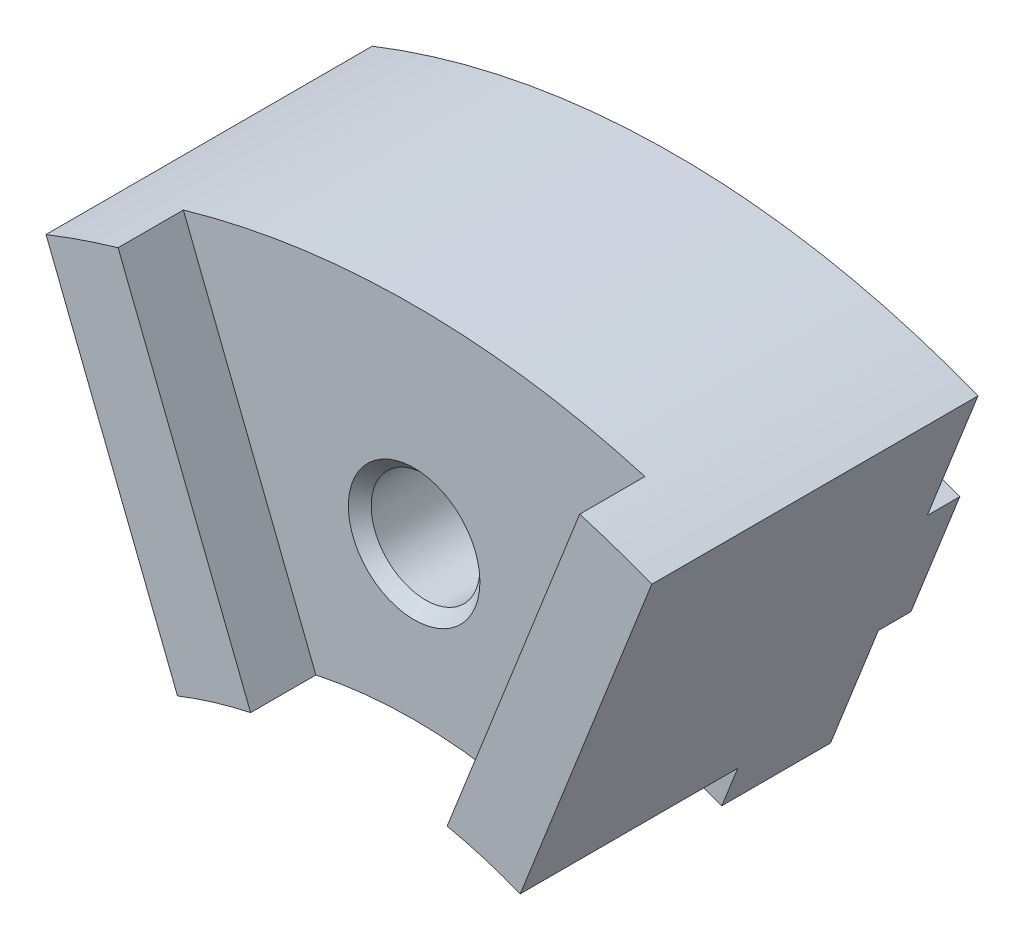
ISO-10303-21;
HEADER;
FILE_DESCRIPTION(('STEP AP214'),'2;1');
FILE_NAME('part.step','',(''),(''),'','','');
FILE_SCHEMA(('AUTOMOTIVE_DESIGN { 1 0 10303 214 1 1 1 1 }'));
ENDSEC;
DATA;
#1=APPLICATION_CONTEXT('core data for automotive mechanical design processes');
#2=APPLICATION_PROTOCOL_DEFINITION('international standard','automotive_design',2000,#1);
#3=PRODUCT_CONTEXT('',#1,'mechanical');
#4=PRODUCT('Part','Part','',(#3));
#5=PRODUCT_RELATED_PRODUCT_CATEGORY('part','',(#4));
#6=PRODUCT_DEFINITION_FORMATION('','',#4);
#7=PRODUCT_DEFINITION_CONTEXT('part definition',#1,'design');
#8=PRODUCT_DEFINITION('design','',#6,#7);
#9=PRODUCT_DEFINITION_SHAPE('','',#8);
#10=(LENGTH_UNIT() NAMED_UNIT(*) SI_UNIT(.MILLI.,.METRE.));
#11=(NAMED_UNIT(*) PLANE_ANGLE_UNIT() SI_UNIT($,.RADIAN.));
#12=(NAMED_UNIT(*) SI_UNIT($,.STERADIAN.) SOLID_ANGLE_UNIT());
#13=UNCERTAINTY_MEASURE_WITH_UNIT(LENGTH_MEASURE(1.E-05),#10,'distance_accuracy_value','');
#14=(GEOMETRIC_REPRESENTATION_CONTEXT(3) GLOBAL_UNCERTAINTY_ASSIGNED_CONTEXT((#13)) GLOBAL_UNIT_ASSIGNED_CONTEXT((#10,
#11,#12)) REPRESENTATION_CONTEXT('',''));
#15=CARTESIAN_POINT('',(0.,0.,0.));
#16=DIRECTION('',(0.,0.,1.));
#17=DIRECTION('',(1.,0.,0.));
#18=AXIS2_PLACEMENT_3D('',#15,#16,#17);
#19=CARTESIAN_POINT('',(0.,0.,0.));
#20=DIRECTION('',(0.,0.,-1.));
#21=DIRECTION('',(-1.,0.,0.));
#22=AXIS2_PLACEMENT_3D('',#19,#20,#21);
#23=PLANE('',#22);
#24=CARTESIAN_POINT('',(0.,28.5,0.));
#25=DIRECTION('',(0.,0.,-1.));
#26=DIRECTION('',(-1.,0.,0.));
#27=AXIS2_PLACEMENT_3D('',#24,#25,#26);
#28=CIRCLE('',#27,2.5);
#29=CARTESIAN_POINT('',(-2.5,28.5,0.));
#30=VERTEX_POINT('',#29);
#31=EDGE_CURVE('E44',#30,#30,#28,.T.);
#32=ORIENTED_EDGE('',*,*,#31,.F.);
#33=EDGE_LOOP('',(#32));
#34=FACE_BOUND('',#33,.T.);
#35=DIRECTION('',(0.366501226724298,-0.930417567982024,0.));
#36=VECTOR('',#35,1.);
#37=CARTESIAN_POINT('',(-7.14677392112381,18.1431425756495,0.));
#38=LINE('',#37,#36);
#39=CARTESIAN_POINT('',(-9.3457812814696,23.7256479835416,0.));
#40=VERTEX_POINT('',#39);
#41=CARTESIAN_POINT('',(-7.14677392112381,18.1431425756495,0.));
#42=VERTEX_POINT('',#41);
#43=EDGE_CURVE('E185',#40,#42,#38,.T.);
#44=ORIENTED_EDGE('',*,*,#43,.F.);
#45=CARTESIAN_POINT('',(0.,0.,0.));
#46=DIRECTION('',(0.,0.,1.));
#47=DIRECTION('',(1.,0.,0.));
#48=AXIS2_PLACEMENT_3D('',#45,#46,#47);
#49=CIRCLE('',#48,25.5);
#50=CARTESIAN_POINT('',(-4.0085103266133,25.1829673581457,0.));
#51=VERTEX_POINT('',#50);
#52=EDGE_CURVE('E179',#51,#40,#49,.T.);
#53=ORIENTED_EDGE('',*,*,#52,.F.);
#54=DIRECTION('',(0.366501226724298,-0.930417567982024,0.));
#55=VECTOR('',#54,1.);
#56=CARTESIAN_POINT('',(-6.29739883182884,30.9936493453214,0.));
#57=LINE('',#56,#55);
#58=CARTESIAN_POINT('',(-6.29739883182884,30.9936493453214,0.));
#59=VERTEX_POINT('',#58);
#60=EDGE_CURVE('E165',#59,#51,#57,.T.);
#61=ORIENTED_EDGE('',*,*,#60,.F.);
#62=CARTESIAN_POINT('',(0.,0.,0.));
#63=DIRECTION('',(0.,0.,-1.));
#64=DIRECTION('',(1.,0.,0.));
#65=AXIS2_PLACEMENT_3D('',#62,#63,#64);
#66=CIRCLE('',#65,31.6269431306261);
#67=CARTESIAN_POINT('',(-11.5913134549141,29.426263510303,0.));
#68=VERTEX_POINT('',#67);
#69=EDGE_CURVE('E172',#68,#59,#66,.T.);
#70=ORIENTED_EDGE('',*,*,#69,.F.);
#71=CARTESIAN_POINT('',(-13.9270466155233,35.3558675833169,0.));
#72=VERTEX_POINT('',#71);
#73=EDGE_CURVE('E278',#72,#68,#38,.T.);
#74=ORIENTED_EDGE('',*,*,#73,.F.);
#75=CARTESIAN_POINT('',(0.,0.,0.));
#76=DIRECTION('',(0.,0.,1.));
#77=DIRECTION('',(-1.,0.,0.));
#78=AXIS2_PLACEMENT_3D('',#75,#76,#77);
#79=CIRCLE('',#78,38.);
#80=CARTESIAN_POINT('',(13.9270466155233,35.3558675833169,0.));
#81=VERTEX_POINT('',#80);
#82=EDGE_CURVE('E285',#81,#72,#79,.T.);
#83=ORIENTED_EDGE('',*,*,#82,.F.);
#84=DIRECTION('',(0.366501226724298,0.930417567982024,0.));
#85=VECTOR('',#84,1.);
#86=CARTESIAN_POINT('',(7.14677392112381,18.1431425756495,0.));
#87=LINE('',#86,#85);
#88=CARTESIAN_POINT('',(11.5913134549141,29.426263510303,0.));
#89=VERTEX_POINT('',#88);
#90=EDGE_CURVE('E281',#89,#81,#87,.T.);
#91=ORIENTED_EDGE('',*,*,#90,.F.);
#92=CARTESIAN_POINT('',(0.,0.,0.));
#93=DIRECTION('',(0.,0.,-1.));
#94=DIRECTION('',(1.,0.,0.));
#95=AXIS2_PLACEMENT_3D('',#92,#93,#94);
#96=CIRCLE('',#95,31.6269431306262);
#97=CARTESIAN_POINT('',(6.29739883182885,30.9936493453214,0.));
#98=VERTEX_POINT('',#97);
#99=EDGE_CURVE('E202',#98,#89,#96,.T.);
#100=ORIENTED_EDGE('',*,*,#99,.F.);
#101=DIRECTION('',(0.366501226724298,0.930417567982024,0.));
#102=VECTOR('',#101,1.);
#103=CARTESIAN_POINT('',(4.0085103266133,25.1829673581457,0.));
#104=LINE('',#103,#102);
#105=CARTESIAN_POINT('',(4.0085103266133,25.1829673581457,0.));
#106=VERTEX_POINT('',#105);
#107=EDGE_CURVE('E64',#106,#98,#104,.T.);
#108=ORIENTED_EDGE('',*,*,#107,.F.);
#109=CARTESIAN_POINT('',(0.,0.,0.));
#110=DIRECTION('',(0.,0.,1.));
#111=DIRECTION('',(1.,0.,0.));
#112=AXIS2_PLACEMENT_3D('',#109,#110,#111);
#113=CIRCLE('',#112,25.5);
#114=CARTESIAN_POINT('',(9.3457812814696,23.7256479835416,0.));
#115=VERTEX_POINT('',#114);
#116=EDGE_CURVE('E186',#115,#106,#113,.T.);
#117=ORIENTED_EDGE('',*,*,#116,.F.);
#118=CARTESIAN_POINT('',(7.14677392112381,18.1431425756495,0.));
#119=VERTEX_POINT('',#118);
#120=EDGE_CURVE('E282',#119,#115,#87,.T.);
#121=ORIENTED_EDGE('',*,*,#120,.F.);
#122=CARTESIAN_POINT('',(0.,0.,0.));
#123=DIRECTION('',(0.,0.,-1.));
#124=DIRECTION('',(-1.,0.,0.));
#125=AXIS2_PLACEMENT_3D('',#122,#123,#124);
#126=CIRCLE('',#125,19.5);
#127=EDGE_CURVE('E273',#42,#119,#126,.T.);
#128=ORIENTED_EDGE('',*,*,#127,.F.);
#129=EDGE_LOOP('',(#44,#53,#61,#70,#74,#83,#91,#100,#108,#117,#121,#128));
#130=FACE_BOUND('',#129,.T.);
#131=ADVANCED_FACE('F40',(#34,#130),#23,.T.);
#132=CARTESIAN_POINT('',(0.,0.,12.));
#133=DIRECTION('',(0.,0.,-1.));
#134=DIRECTION('',(-1.,0.,0.));
#135=AXIS2_PLACEMENT_3D('',#132,#133,#134);
#136=PLANE('',#135);
#137=CARTESIAN_POINT('',(0.,28.5,12.));
#138=DIRECTION('',(0.,0.,1.));
#139=DIRECTION('',(1.,0.,0.));
#140=AXIS2_PLACEMENT_3D('',#137,#138,#139);
#141=CIRCLE('',#140,3.025);
#142=CARTESIAN_POINT('',(3.025,28.5,12.));
#143=VERTEX_POINT('',#142);
#144=EDGE_CURVE('E352',#143,#143,#141,.T.);
#145=ORIENTED_EDGE('',*,*,#144,.F.);
#146=EDGE_LOOP('',(#145));
#147=FACE_BOUND('',#146,.T.);
#148=DIRECTION('',(-0.366501226724299,-0.930417567982024,0.));
#149=VECTOR('',#148,1.);
#150=CARTESIAN_POINT('',(4.5182035939611,21.0198914431906,12.));
#151=LINE('',#150,#149);
#152=CARTESIAN_POINT('',(10.6113850951982,36.4883338392068,12.));
#153=VERTEX_POINT('',#152);
#154=CARTESIAN_POINT('',(4.5182035939611,21.0198914431906,12.));
#155=VERTEX_POINT('',#154);
#156=EDGE_CURVE('E227',#153,#155,#151,.T.);
#157=ORIENTED_EDGE('',*,*,#156,.F.);
#158=CARTESIAN_POINT('',(0.,0.,12.));
#159=DIRECTION('',(0.,0.,1.));
#160=DIRECTION('',(-1.,0.,0.));
#161=AXIS2_PLACEMENT_3D('',#158,#159,#160);
#162=CIRCLE('',#161,38.);
#163=CARTESIAN_POINT('',(-10.6113850951982,36.4883338392068,12.));
#164=VERTEX_POINT('',#163);
#165=EDGE_CURVE('E275',#153,#164,#162,.T.);
#166=ORIENTED_EDGE('',*,*,#165,.T.);
#167=DIRECTION('',(-0.366501226724298,0.930417567982024,0.));
#168=VECTOR('',#167,1.);
#169=CARTESIAN_POINT('',(-10.6113850951982,36.4883338392068,12.));
#170=LINE('',#169,#168);
#171=CARTESIAN_POINT('',(-4.5182035939611,21.0198914431906,12.));
#172=VERTEX_POINT('',#171);
#173=EDGE_CURVE('E230',#172,#164,#170,.T.);
#174=ORIENTED_EDGE('',*,*,#173,.F.);
#175=CARTESIAN_POINT('',(0.,0.,12.));
#176=DIRECTION('',(0.,0.,1.));
#177=DIRECTION('',(-1.,0.,0.));
#178=AXIS2_PLACEMENT_3D('',#175,#176,#177);
#179=CIRCLE('',#178,21.5);
#180=EDGE_CURVE('E258',#155,#172,#179,.T.);
#181=ORIENTED_EDGE('',*,*,#180,.F.);
#182=EDGE_LOOP('',(#157,#166,#174,#181));
#183=FACE_BOUND('',#182,.T.);
#184=ADVANCED_FACE('F324',(#147,#183),#136,.F.);
#185=CARTESIAN_POINT('',(0.,0.,12.));
#186=DIRECTION('',(0.,0.,-1.));
#187=DIRECTION('',(-1.,0.,0.));
#188=AXIS2_PLACEMENT_3D('',#185,#186,#187);
#189=CYLINDRICAL_SURFACE('',#188,19.5);
#190=CARTESIAN_POINT('',(0.,0.,5.));
#191=DIRECTION('',(0.,0.,-1.));
#192=DIRECTION('',(1.,0.,0.));
#193=AXIS2_PLACEMENT_3D('',#190,#191,#192);
#194=CIRCLE('',#193,19.5);
#195=CARTESIAN_POINT('',(-7.14677392112381,18.1431425756495,5.));
#196=VERTEX_POINT('',#195);
#197=CARTESIAN_POINT('',(7.14677392112381,18.1431425756495,5.));
#198=VERTEX_POINT('',#197);
#199=EDGE_CURVE('E259',#196,#198,#194,.T.);
#200=ORIENTED_EDGE('',*,*,#199,.F.);
#201=DIRECTION('',(0.,0.,-1.));
#202=VECTOR('',#201,1.);
#203=CARTESIAN_POINT('',(-7.14677392112381,18.1431425756495,12.));
#204=LINE('',#203,#202);
#205=EDGE_CURVE('E277',#196,#42,#204,.T.);
#206=ORIENTED_EDGE('',*,*,#205,.T.);
#207=ORIENTED_EDGE('',*,*,#127,.T.);
#208=DIRECTION('',(0.,0.,-1.));
#209=VECTOR('',#208,1.);
#210=CARTESIAN_POINT('',(7.14677392112381,18.1431425756495,12.));
#211=LINE('',#210,#209);
#212=EDGE_CURVE('E11',#198,#119,#211,.T.);
#213=ORIENTED_EDGE('',*,*,#212,.F.);
#214=EDGE_LOOP('',(#200,#206,#207,#213));
#215=FACE_BOUND('',#214,.T.);
#216=ADVANCED_FACE('F42',(#215),#189,.F.);
#217=CARTESIAN_POINT('',(7.14677392112381,18.1431425756495,12.));
#218=DIRECTION('',(-0.930417567982024,0.366501226724298,0.));
#219=DIRECTION('',(-0.366501226724298,-0.930417567982024,0.));
#220=AXIS2_PLACEMENT_3D('',#217,#218,#219);
#221=PLANE('',#220);
#222=DIRECTION('',(0.,0.,-1.));
#223=VECTOR('',#222,1.);
#224=CARTESIAN_POINT('',(13.9270466155233,35.3558675833169,12.));
#225=LINE('',#224,#223);
#226=CARTESIAN_POINT('',(13.9270466155233,35.3558675833169,15.));
#227=VERTEX_POINT('',#226);
#228=EDGE_CURVE('E49',#227,#81,#225,.T.);
#229=ORIENTED_EDGE('',*,*,#228,.F.);
#230=DIRECTION('',(0.366501226724299,0.930417567982024,0.));
#231=VECTOR('',#230,1.);
#232=CARTESIAN_POINT('',(7.87977637457241,20.0039777116135,15.));
#233=LINE('',#232,#231);
#234=CARTESIAN_POINT('',(7.87977637457241,20.0039777116135,15.));
#235=VERTEX_POINT('',#234);
#236=EDGE_CURVE('E235',#235,#227,#233,.T.);
#237=ORIENTED_EDGE('',*,*,#236,.F.);
#238=DIRECTION('',(0.,0.,1.));
#239=VECTOR('',#238,1.);
#240=CARTESIAN_POINT('',(7.87977637457241,20.0039777116135,5.));
#241=LINE('',#240,#239);
#242=CARTESIAN_POINT('',(7.87977637457241,20.0039777116135,5.));
#243=VERTEX_POINT('',#242);
#244=EDGE_CURVE('E269',#243,#235,#241,.T.);
#245=ORIENTED_EDGE('',*,*,#244,.F.);
#246=DIRECTION('',(0.366501226724298,0.930417567982024,0.));
#247=VECTOR('',#246,1.);
#248=CARTESIAN_POINT('',(7.14677392112381,18.1431425756495,5.));
#249=LINE('',#248,#247);
#250=EDGE_CURVE('E261',#198,#243,#249,.T.);
#251=ORIENTED_EDGE('',*,*,#250,.F.);
#252=ORIENTED_EDGE('',*,*,#212,.T.);
#253=ORIENTED_EDGE('',*,*,#120,.T.);
#254=DIRECTION('',(0.,0.,1.));
#255=VECTOR('',#254,1.);
#256=CARTESIAN_POINT('',(9.3457812814696,23.7256479835416,-1.5));
#257=LINE('',#256,#255);
#258=CARTESIAN_POINT('',(9.3457812814696,23.7256479835416,-1.5));
#259=VERTEX_POINT('',#258);
#260=EDGE_CURVE('E207',#259,#115,#257,.T.);
#261=ORIENTED_EDGE('',*,*,#260,.F.);
#262=DIRECTION('',(-0.366501226724298,-0.930417567982024,0.));
#263=VECTOR('',#262,1.);
#264=CARTESIAN_POINT('',(9.3457812814696,23.7256479835416,-1.5));
#265=LINE('',#264,#263);
#266=CARTESIAN_POINT('',(11.5913134549141,29.426263510303,-1.5));
#267=VERTEX_POINT('',#266);
#268=EDGE_CURVE('E206',#267,#259,#265,.T.);
#269=ORIENTED_EDGE('',*,*,#268,.F.);
#270=DIRECTION('',(0.,0.,1.));
#271=VECTOR('',#270,1.);
#272=CARTESIAN_POINT('',(11.5913134549141,29.426263510303,-1.5));
#273=LINE('',#272,#271);
#274=EDGE_CURVE('E214',#267,#89,#273,.T.);
#275=ORIENTED_EDGE('',*,*,#274,.T.);
#276=ORIENTED_EDGE('',*,*,#90,.T.);
#277=EDGE_LOOP('',(#229,#237,#245,#251,#252,#253,#261,#269,#275,#276));
#278=FACE_BOUND('',#277,.T.);
#279=ADVANCED_FACE('F333',(#278),#221,.F.);
#280=CARTESIAN_POINT('',(0.,0.,12.));
#281=DIRECTION('',(0.,0.,-1.));
#282=DIRECTION('',(-1.,0.,0.));
#283=AXIS2_PLACEMENT_3D('',#280,#281,#282);
#284=CYLINDRICAL_SURFACE('',#283,38.);
#285=ORIENTED_EDGE('',*,*,#82,.T.);
#286=DIRECTION('',(0.,0.,-1.));
#287=VECTOR('',#286,1.);
#288=CARTESIAN_POINT('',(-13.9270466155233,35.3558675833169,12.));
#289=LINE('',#288,#287);
#290=CARTESIAN_POINT('',(-13.9270466155233,35.3558675833169,15.));
#291=VERTEX_POINT('',#290);
#292=EDGE_CURVE('E291',#291,#72,#289,.T.);
#293=ORIENTED_EDGE('',*,*,#292,.F.);
#294=CARTESIAN_POINT('',(0.,0.,15.));
#295=DIRECTION('',(0.,0.,1.));
#296=DIRECTION('',(1.,0.,0.));
#297=AXIS2_PLACEMENT_3D('',#294,#295,#296);
#298=CIRCLE('',#297,38.);
#299=CARTESIAN_POINT('',(-10.6113850951982,36.4883338392068,15.));
#300=VERTEX_POINT('',#299);
#301=EDGE_CURVE('E240',#300,#291,#298,.T.);
#302=ORIENTED_EDGE('',*,*,#301,.F.);
#303=DIRECTION('',(0.,0.,-1.));
#304=VECTOR('',#303,1.);
#305=CARTESIAN_POINT('',(-10.6113850951982,36.4883338392068,15.));
#306=LINE('',#305,#304);
#307=EDGE_CURVE('E250',#300,#164,#306,.T.);
#308=ORIENTED_EDGE('',*,*,#307,.T.);
#309=ORIENTED_EDGE('',*,*,#165,.F.);
#310=DIRECTION('',(0.,0.,-1.));
#311=VECTOR('',#310,1.);
#312=CARTESIAN_POINT('',(10.6113850951982,36.4883338392068,15.));
#313=LINE('',#312,#311);
#314=CARTESIAN_POINT('',(10.6113850951982,36.4883338392068,15.));
#315=VERTEX_POINT('',#314);
#316=EDGE_CURVE('E222',#315,#153,#313,.T.);
#317=ORIENTED_EDGE('',*,*,#316,.F.);
#318=CARTESIAN_POINT('',(0.,0.,15.));
#319=DIRECTION('',(0.,0.,1.));
#320=DIRECTION('',(1.,0.,0.));
#321=AXIS2_PLACEMENT_3D('',#318,#319,#320);
#322=CIRCLE('',#321,38.);
#323=EDGE_CURVE('E233',#227,#315,#322,.T.);
#324=ORIENTED_EDGE('',*,*,#323,.F.);
#325=ORIENTED_EDGE('',*,*,#228,.T.);
#326=EDGE_LOOP('',(#285,#293,#302,#308,#309,#317,#324,#325));
#327=FACE_BOUND('',#326,.T.);
#328=ADVANCED_FACE('F298',(#327),#284,.T.);
#329=CARTESIAN_POINT('',(-7.14677392112381,18.1431425756495,12.));
#330=DIRECTION('',(0.930417567982024,0.366501226724298,0.));
#331=DIRECTION('',(-0.366501226724298,0.930417567982024,0.));
#332=AXIS2_PLACEMENT_3D('',#329,#330,#331);
#333=PLANE('',#332);
#334=DIRECTION('',(0.366501226724298,-0.930417567982024,0.));
#335=VECTOR('',#334,1.);
#336=CARTESIAN_POINT('',(-7.87977637457241,20.0039777116135,5.));
#337=LINE('',#336,#335);
#338=CARTESIAN_POINT('',(-7.87977637457241,20.0039777116135,5.));
#339=VERTEX_POINT('',#338);
#340=EDGE_CURVE('E267',#339,#196,#337,.T.);
#341=ORIENTED_EDGE('',*,*,#340,.F.);
#342=DIRECTION('',(0.,0.,1.));
#343=VECTOR('',#342,1.);
#344=CARTESIAN_POINT('',(-7.87977637457241,20.0039777116135,5.));
#345=LINE('',#344,#343);
#346=CARTESIAN_POINT('',(-7.87977637457241,20.0039777116135,15.));
#347=VERTEX_POINT('',#346);
#348=EDGE_CURVE('E271',#339,#347,#345,.T.);
#349=ORIENTED_EDGE('',*,*,#348,.T.);
#350=DIRECTION('',(0.366501226724298,-0.930417567982024,0.));
#351=VECTOR('',#350,1.);
#352=CARTESIAN_POINT('',(-13.9270466155233,35.3558675833169,15.));
#353=LINE('',#352,#351);
#354=EDGE_CURVE('E243',#291,#347,#353,.T.);
#355=ORIENTED_EDGE('',*,*,#354,.F.);
#356=ORIENTED_EDGE('',*,*,#292,.T.);
#357=ORIENTED_EDGE('',*,*,#73,.T.);
#358=DIRECTION('',(0.,0.,1.));
#359=VECTOR('',#358,1.);
#360=CARTESIAN_POINT('',(-11.5913134549141,29.426263510303,-1.5));
#361=LINE('',#360,#359);
#362=CARTESIAN_POINT('',(-11.5913134549141,29.426263510303,-1.5));
#363=VERTEX_POINT('',#362);
#364=EDGE_CURVE('E307',#363,#68,#361,.T.);
#365=ORIENTED_EDGE('',*,*,#364,.F.);
#366=DIRECTION('',(-0.366501226724298,0.930417567982024,0.));
#367=VECTOR('',#366,1.);
#368=CARTESIAN_POINT('',(-11.5913134549141,29.426263510303,-1.5));
#369=LINE('',#368,#367);
#370=CARTESIAN_POINT('',(-9.3457812814696,23.7256479835416,-1.5));
#371=VERTEX_POINT('',#370);
#372=EDGE_CURVE('E195',#371,#363,#369,.T.);
#373=ORIENTED_EDGE('',*,*,#372,.F.);
#374=DIRECTION('',(0.,0.,1.));
#375=VECTOR('',#374,1.);
#376=CARTESIAN_POINT('',(-9.3457812814696,23.7256479835416,-1.5));
#377=LINE('',#376,#375);
#378=EDGE_CURVE('E343',#371,#40,#377,.T.);
#379=ORIENTED_EDGE('',*,*,#378,.T.);
#380=ORIENTED_EDGE('',*,*,#43,.T.);
#381=ORIENTED_EDGE('',*,*,#205,.F.);
#382=EDGE_LOOP('',(#341,#349,#355,#356,#357,#365,#373,#379,#380,#381));
#383=FACE_BOUND('',#382,.T.);
#384=ADVANCED_FACE('F306',(#383),#333,.F.);
#385=CARTESIAN_POINT('',(0.,0.,5.));
#386=DIRECTION('',(0.,0.,1.));
#387=DIRECTION('',(1.,0.,0.));
#388=AXIS2_PLACEMENT_3D('',#385,#386,#387);
#389=CYLINDRICAL_SURFACE('',#388,21.5);
#390=ORIENTED_EDGE('',*,*,#244,.T.);
#391=CARTESIAN_POINT('',(0.,0.,15.));
#392=DIRECTION('',(0.,0.,-1.));
#393=DIRECTION('',(1.,0.,0.));
#394=AXIS2_PLACEMENT_3D('',#391,#392,#393);
#395=CIRCLE('',#394,21.5);
#396=CARTESIAN_POINT('',(4.5182035939611,21.0198914431906,15.));
#397=VERTEX_POINT('',#396);
#398=EDGE_CURVE('E231',#397,#235,#395,.T.);
#399=ORIENTED_EDGE('',*,*,#398,.F.);
#400=DIRECTION('',(0.,0.,-1.));
#401=VECTOR('',#400,1.);
#402=CARTESIAN_POINT('',(4.5182035939611,21.0198914431906,15.));
#403=LINE('',#402,#401);
#404=EDGE_CURVE('E224',#397,#155,#403,.T.);
#405=ORIENTED_EDGE('',*,*,#404,.T.);
#406=ORIENTED_EDGE('',*,*,#180,.T.);
#407=DIRECTION('',(0.,0.,-1.));
#408=VECTOR('',#407,1.);
#409=CARTESIAN_POINT('',(-4.5182035939611,21.0198914431906,15.));
#410=LINE('',#409,#408);
#411=CARTESIAN_POINT('',(-4.5182035939611,21.0198914431906,15.));
#412=VERTEX_POINT('',#411);
#413=EDGE_CURVE('E255',#412,#172,#410,.T.);
#414=ORIENTED_EDGE('',*,*,#413,.F.);
#415=CARTESIAN_POINT('',(0.,0.,15.));
#416=DIRECTION('',(0.,0.,-1.));
#417=DIRECTION('',(1.,0.,0.));
#418=AXIS2_PLACEMENT_3D('',#415,#416,#417);
#419=CIRCLE('',#418,21.5);
#420=EDGE_CURVE('E246',#347,#412,#419,.T.);
#421=ORIENTED_EDGE('',*,*,#420,.F.);
#422=ORIENTED_EDGE('',*,*,#348,.F.);
#423=CARTESIAN_POINT('',(0.,0.,5.));
#424=DIRECTION('',(0.,0.,1.));
#425=DIRECTION('',(-1.,0.,0.));
#426=AXIS2_PLACEMENT_3D('',#423,#424,#425);
#427=CIRCLE('',#426,21.5);
#428=EDGE_CURVE('E264',#243,#339,#427,.T.);
#429=ORIENTED_EDGE('',*,*,#428,.F.);
#430=EDGE_LOOP('',(#390,#399,#405,#406,#414,#421,#422,#429));
#431=FACE_BOUND('',#430,.T.);
#432=ADVANCED_FACE('F337',(#431),#389,.F.);
#433=CARTESIAN_POINT('',(0.,0.,5.));
#434=DIRECTION('',(0.,0.,1.));
#435=DIRECTION('',(1.,0.,0.));
#436=AXIS2_PLACEMENT_3D('',#433,#434,#435);
#437=PLANE('',#436);
#438=ORIENTED_EDGE('',*,*,#199,.T.);
#439=ORIENTED_EDGE('',*,*,#250,.T.);
#440=ORIENTED_EDGE('',*,*,#428,.T.);
#441=ORIENTED_EDGE('',*,*,#340,.T.);
#442=EDGE_LOOP('',(#438,#439,#440,#441));
#443=FACE_BOUND('',#442,.T.);
#444=ADVANCED_FACE('F339',(#443),#437,.T.);
#445=CARTESIAN_POINT('',(-10.6113850951982,36.4883338392068,15.));
#446=DIRECTION('',(-0.930417567982024,-0.366501226724298,0.));
#447=DIRECTION('',(0.366501226724298,-0.930417567982024,0.));
#448=AXIS2_PLACEMENT_3D('',#445,#446,#447);
#449=PLANE('',#448);
#450=ORIENTED_EDGE('',*,*,#173,.T.);
#451=ORIENTED_EDGE('',*,*,#307,.F.);
#452=DIRECTION('',(-0.366501226724298,0.930417567982024,0.));
#453=VECTOR('',#452,1.);
#454=CARTESIAN_POINT('',(-10.6113850951982,36.4883338392068,15.));
#455=LINE('',#454,#453);
#456=EDGE_CURVE('E248',#412,#300,#455,.T.);
#457=ORIENTED_EDGE('',*,*,#456,.F.);
#458=ORIENTED_EDGE('',*,*,#413,.T.);
#459=EDGE_LOOP('',(#450,#451,#457,#458));
#460=FACE_BOUND('',#459,.T.);
#461=ADVANCED_FACE('F319',(#460),#449,.F.);
#462=CARTESIAN_POINT('',(0.,0.,15.));
#463=DIRECTION('',(0.,0.,1.));
#464=DIRECTION('',(1.,0.,0.));
#465=AXIS2_PLACEMENT_3D('',#462,#463,#464);
#466=PLANE('',#465);
#467=ORIENTED_EDGE('',*,*,#301,.T.);
#468=ORIENTED_EDGE('',*,*,#354,.T.);
#469=ORIENTED_EDGE('',*,*,#420,.T.);
#470=ORIENTED_EDGE('',*,*,#456,.T.);
#471=EDGE_LOOP('',(#467,#468,#469,#470));
#472=FACE_BOUND('',#471,.T.);
#473=ADVANCED_FACE('F314',(#472),#466,.T.);
#474=CARTESIAN_POINT('',(4.5182035939611,21.0198914431906,15.));
#475=DIRECTION('',(0.930417567982024,-0.366501226724299,0.));
#476=DIRECTION('',(0.366501226724299,0.930417567982024,0.));
#477=AXIS2_PLACEMENT_3D('',#474,#475,#476);
#478=PLANE('',#477);
#479=ORIENTED_EDGE('',*,*,#156,.T.);
#480=ORIENTED_EDGE('',*,*,#404,.F.);
#481=DIRECTION('',(-0.366501226724299,-0.930417567982024,0.));
#482=VECTOR('',#481,1.);
#483=CARTESIAN_POINT('',(4.5182035939611,21.0198914431906,15.));
#484=LINE('',#483,#482);
#485=EDGE_CURVE('E226',#315,#397,#484,.T.);
#486=ORIENTED_EDGE('',*,*,#485,.F.);
#487=ORIENTED_EDGE('',*,*,#316,.T.);
#488=EDGE_LOOP('',(#479,#480,#486,#487));
#489=FACE_BOUND('',#488,.T.);
#490=ADVANCED_FACE('F328',(#489),#478,.F.);
#491=CARTESIAN_POINT('',(0.,0.,15.));
#492=DIRECTION('',(0.,0.,1.));
#493=DIRECTION('',(1.,0.,0.));
#494=AXIS2_PLACEMENT_3D('',#491,#492,#493);
#495=PLANE('',#494);
#496=ORIENTED_EDGE('',*,*,#398,.T.);
#497=ORIENTED_EDGE('',*,*,#236,.T.);
#498=ORIENTED_EDGE('',*,*,#323,.T.);
#499=ORIENTED_EDGE('',*,*,#485,.T.);
#500=EDGE_LOOP('',(#496,#497,#498,#499));
#501=FACE_BOUND('',#500,.T.);
#502=ADVANCED_FACE('F331',(#501),#495,.T.);
#503=CARTESIAN_POINT('',(0.,0.,-1.5));
#504=DIRECTION('',(0.,0.,1.));
#505=DIRECTION('',(1.,0.,0.));
#506=AXIS2_PLACEMENT_3D('',#503,#504,#505);
#507=CYLINDRICAL_SURFACE('',#506,25.5);
#508=ORIENTED_EDGE('',*,*,#116,.T.);
#509=DIRECTION('',(0.,0.,1.));
#510=VECTOR('',#509,1.);
#511=CARTESIAN_POINT('',(4.0085103266133,25.1829673581457,-1.5));
#512=LINE('',#511,#510);
#513=CARTESIAN_POINT('',(4.0085103266133,25.1829673581457,-1.5));
#514=VERTEX_POINT('',#513);
#515=EDGE_CURVE('E220',#514,#106,#512,.T.);
#516=ORIENTED_EDGE('',*,*,#515,.F.);
#517=CARTESIAN_POINT('',(0.,0.,-1.5));
#518=DIRECTION('',(0.,0.,1.));
#519=DIRECTION('',(1.,0.,0.));
#520=AXIS2_PLACEMENT_3D('',#517,#518,#519);
#521=CIRCLE('',#520,25.5);
#522=EDGE_CURVE('E198',#259,#514,#521,.T.);
#523=ORIENTED_EDGE('',*,*,#522,.F.);
#524=ORIENTED_EDGE('',*,*,#260,.T.);
#525=EDGE_LOOP('',(#508,#516,#523,#524));
#526=FACE_BOUND('',#525,.T.);
#527=ADVANCED_FACE('F420',(#526),#507,.F.);
#528=CARTESIAN_POINT('',(4.0085103266133,25.1829673581457,-1.5));
#529=DIRECTION('',(0.930417567982024,-0.366501226724298,0.));
#530=DIRECTION('',(0.366501226724298,0.930417567982024,0.));
#531=AXIS2_PLACEMENT_3D('',#528,#529,#530);
#532=PLANE('',#531);
#533=ORIENTED_EDGE('',*,*,#107,.T.);
#534=DIRECTION('',(0.,0.,1.));
#535=VECTOR('',#534,1.);
#536=CARTESIAN_POINT('',(6.29739883182885,30.9936493453214,-1.5));
#537=LINE('',#536,#535);
#538=CARTESIAN_POINT('',(6.29739883182885,30.9936493453214,-1.5));
#539=VERTEX_POINT('',#538);
#540=EDGE_CURVE('E217',#539,#98,#537,.T.);
#541=ORIENTED_EDGE('',*,*,#540,.F.);
#542=DIRECTION('',(0.366501226724298,0.930417567982024,0.));
#543=VECTOR('',#542,1.);
#544=CARTESIAN_POINT('',(4.0085103266133,25.1829673581457,-1.5));
#545=LINE('',#544,#543);
#546=EDGE_CURVE('E201',#514,#539,#545,.T.);
#547=ORIENTED_EDGE('',*,*,#546,.F.);
#548=ORIENTED_EDGE('',*,*,#515,.T.);
#549=EDGE_LOOP('',(#533,#541,#547,#548));
#550=FACE_BOUND('',#549,.T.);
#551=ADVANCED_FACE('F426',(#550),#532,.F.);
#552=CARTESIAN_POINT('',(0.,0.,-1.5));
#553=DIRECTION('',(0.,0.,1.));
#554=DIRECTION('',(1.,0.,0.));
#555=AXIS2_PLACEMENT_3D('',#552,#553,#554);
#556=CYLINDRICAL_SURFACE('',#555,31.6269431306262);
#557=ORIENTED_EDGE('',*,*,#99,.T.);
#558=ORIENTED_EDGE('',*,*,#274,.F.);
#559=CARTESIAN_POINT('',(0.,0.,-1.5));
#560=DIRECTION('',(0.,0.,-1.));
#561=DIRECTION('',(1.,0.,0.));
#562=AXIS2_PLACEMENT_3D('',#559,#560,#561);
#563=CIRCLE('',#562,31.6269431306262);
#564=EDGE_CURVE('E204',#539,#267,#563,.T.);
#565=ORIENTED_EDGE('',*,*,#564,.F.);
#566=ORIENTED_EDGE('',*,*,#540,.T.);
#567=EDGE_LOOP('',(#557,#558,#565,#566));
#568=FACE_BOUND('',#567,.T.);
#569=ADVANCED_FACE('F434',(#568),#556,.T.);
#570=CARTESIAN_POINT('',(0.,0.,-1.5));
#571=DIRECTION('',(0.,0.,1.));
#572=DIRECTION('',(1.,0.,0.));
#573=AXIS2_PLACEMENT_3D('',#570,#571,#572);
#574=PLANE('',#573);
#575=ORIENTED_EDGE('',*,*,#522,.T.);
#576=ORIENTED_EDGE('',*,*,#546,.T.);
#577=ORIENTED_EDGE('',*,*,#564,.T.);
#578=ORIENTED_EDGE('',*,*,#268,.T.);
#579=EDGE_LOOP('',(#575,#576,#577,#578));
#580=FACE_BOUND('',#579,.T.);
#581=ADVANCED_FACE('F442',(#580),#574,.F.);
#582=CARTESIAN_POINT('',(0.,0.,-1.5));
#583=DIRECTION('',(0.,0.,1.));
#584=DIRECTION('',(1.,0.,0.));
#585=AXIS2_PLACEMENT_3D('',#582,#583,#584);
#586=CYLINDRICAL_SURFACE('',#585,25.5);
#587=ORIENTED_EDGE('',*,*,#52,.T.);
#588=ORIENTED_EDGE('',*,*,#378,.F.);
#589=CARTESIAN_POINT('',(0.,0.,-1.5));
#590=DIRECTION('',(0.,0.,1.));
#591=DIRECTION('',(1.,0.,0.));
#592=AXIS2_PLACEMENT_3D('',#589,#590,#591);
#593=CIRCLE('',#592,25.5);
#594=CARTESIAN_POINT('',(-4.0085103266133,25.1829673581457,-1.5));
#595=VERTEX_POINT('',#594);
#596=EDGE_CURVE('E173',#595,#371,#593,.T.);
#597=ORIENTED_EDGE('',*,*,#596,.F.);
#598=DIRECTION('',(0.,0.,1.));
#599=VECTOR('',#598,1.);
#600=CARTESIAN_POINT('',(-4.0085103266133,25.1829673581457,-1.5));
#601=LINE('',#600,#599);
#602=EDGE_CURVE('E168',#595,#51,#601,.T.);
#603=ORIENTED_EDGE('',*,*,#602,.T.);
#604=EDGE_LOOP('',(#587,#588,#597,#603));
#605=FACE_BOUND('',#604,.T.);
#606=ADVANCED_FACE('F177',(#605),#586,.F.);
#607=CARTESIAN_POINT('',(0.,0.,-1.5));
#608=DIRECTION('',(0.,0.,1.));
#609=DIRECTION('',(1.,0.,0.));
#610=AXIS2_PLACEMENT_3D('',#607,#608,#609);
#611=CYLINDRICAL_SURFACE('',#610,31.6269431306261);
#612=ORIENTED_EDGE('',*,*,#69,.T.);
#613=DIRECTION('',(0.,0.,1.));
#614=VECTOR('',#613,1.);
#615=CARTESIAN_POINT('',(-6.29739883182884,30.9936493453214,-1.5));
#616=LINE('',#615,#614);
#617=CARTESIAN_POINT('',(-6.29739883182884,30.9936493453214,-1.5));
#618=VERTEX_POINT('',#617);
#619=EDGE_CURVE('E56',#618,#59,#616,.T.);
#620=ORIENTED_EDGE('',*,*,#619,.F.);
#621=CARTESIAN_POINT('',(0.,0.,-1.5));
#622=DIRECTION('',(0.,0.,-1.));
#623=DIRECTION('',(1.,0.,0.));
#624=AXIS2_PLACEMENT_3D('',#621,#622,#623);
#625=CIRCLE('',#624,31.6269431306261);
#626=EDGE_CURVE('E193',#363,#618,#625,.T.);
#627=ORIENTED_EDGE('',*,*,#626,.F.);
#628=ORIENTED_EDGE('',*,*,#364,.T.);
#629=EDGE_LOOP('',(#612,#620,#627,#628));
#630=FACE_BOUND('',#629,.T.);
#631=ADVANCED_FACE('F457',(#630),#611,.T.);
#632=CARTESIAN_POINT('',(-6.29739883182884,30.9936493453214,-1.5));
#633=DIRECTION('',(-0.930417567982024,-0.366501226724298,0.));
#634=DIRECTION('',(0.366501226724298,-0.930417567982024,0.));
#635=AXIS2_PLACEMENT_3D('',#632,#633,#634);
#636=PLANE('',#635);
#637=ORIENTED_EDGE('',*,*,#60,.T.);
#638=ORIENTED_EDGE('',*,*,#602,.F.);
#639=DIRECTION('',(0.366501226724298,-0.930417567982024,0.));
#640=VECTOR('',#639,1.);
#641=CARTESIAN_POINT('',(-6.29739883182884,30.9936493453214,-1.5));
#642=LINE('',#641,#640);
#643=EDGE_CURVE('E182',#618,#595,#642,.T.);
#644=ORIENTED_EDGE('',*,*,#643,.F.);
#645=ORIENTED_EDGE('',*,*,#619,.T.);
#646=EDGE_LOOP('',(#637,#638,#644,#645));
#647=FACE_BOUND('',#646,.T.);
#648=ADVANCED_FACE('F167',(#647),#636,.F.);
#649=CARTESIAN_POINT('',(0.,0.,-1.5));
#650=DIRECTION('',(0.,0.,1.));
#651=DIRECTION('',(1.,0.,0.));
#652=AXIS2_PLACEMENT_3D('',#649,#650,#651);
#653=PLANE('',#652);
#654=ORIENTED_EDGE('',*,*,#596,.T.);
#655=ORIENTED_EDGE('',*,*,#372,.T.);
#656=ORIENTED_EDGE('',*,*,#626,.T.);
#657=ORIENTED_EDGE('',*,*,#643,.T.);
#658=EDGE_LOOP('',(#654,#655,#656,#657));
#659=FACE_BOUND('',#658,.T.);
#660=ADVANCED_FACE('F471',(#659),#653,.F.);
#661=CARTESIAN_POINT('',(0.,28.5,12.));
#662=DIRECTION('',(0.,0.,1.));
#663=DIRECTION('',(1.,0.,0.));
#664=AXIS2_PLACEMENT_3D('',#661,#662,#663);
#665=CYLINDRICAL_SURFACE('',#664,2.5);
#666=ORIENTED_EDGE('',*,*,#31,.T.);
#667=EDGE_LOOP('',(#666));
#668=FACE_BOUND('',#667,.T.);
#669=CARTESIAN_POINT('',(0.,28.5,11.475));
#670=DIRECTION('',(0.,0.,1.));
#671=DIRECTION('',(1.,0.,0.));
#672=AXIS2_PLACEMENT_3D('',#669,#670,#671);
#673=CIRCLE('',#672,2.5);
#674=CARTESIAN_POINT('',(2.5,28.5,11.475));
#675=VERTEX_POINT('',#674);
#676=EDGE_CURVE('E347',#675,#675,#673,.T.);
#677=ORIENTED_EDGE('',*,*,#676,.T.);
#678=EDGE_LOOP('',(#677));
#679=FACE_BOUND('',#678,.T.);
#680=ADVANCED_FACE('F478',(#668,#679),#665,.F.);
#681=CARTESIAN_POINT('',(0.,28.5,12.));
#682=DIRECTION('',(0.,0.,1.));
#683=DIRECTION('',(1.,0.,0.));
#684=AXIS2_PLACEMENT_3D('',#681,#682,#683);
#685=CONICAL_SURFACE('',#684,3.025,0.785398163397447);
#686=ORIENTED_EDGE('',*,*,#676,.F.);
#687=EDGE_LOOP('',(#686));
#688=FACE_BOUND('',#687,.T.);
#689=ORIENTED_EDGE('',*,*,#144,.T.);
#690=EDGE_LOOP('',(#689));
#691=FACE_BOUND('',#690,.T.);
#692=ADVANCED_FACE('F356',(#688,#691),#685,.F.);
#693=CLOSED_SHELL('',(#131,#184,#216,#279,#328,#384,#432,#444,#461,#473,#490,#502,#527,#551,
#569,#581,#606,#631,#648,#660,#680,#692));
#694=MANIFOLD_SOLID_BREP('B2',#693);
#695=ADVANCED_BREP_SHAPE_REPRESENTATION('',(#18,#694),#14);
#696=SHAPE_DEFINITION_REPRESENTATION(#9,#695);
ENDSEC;
END-ISO-10303-21;
